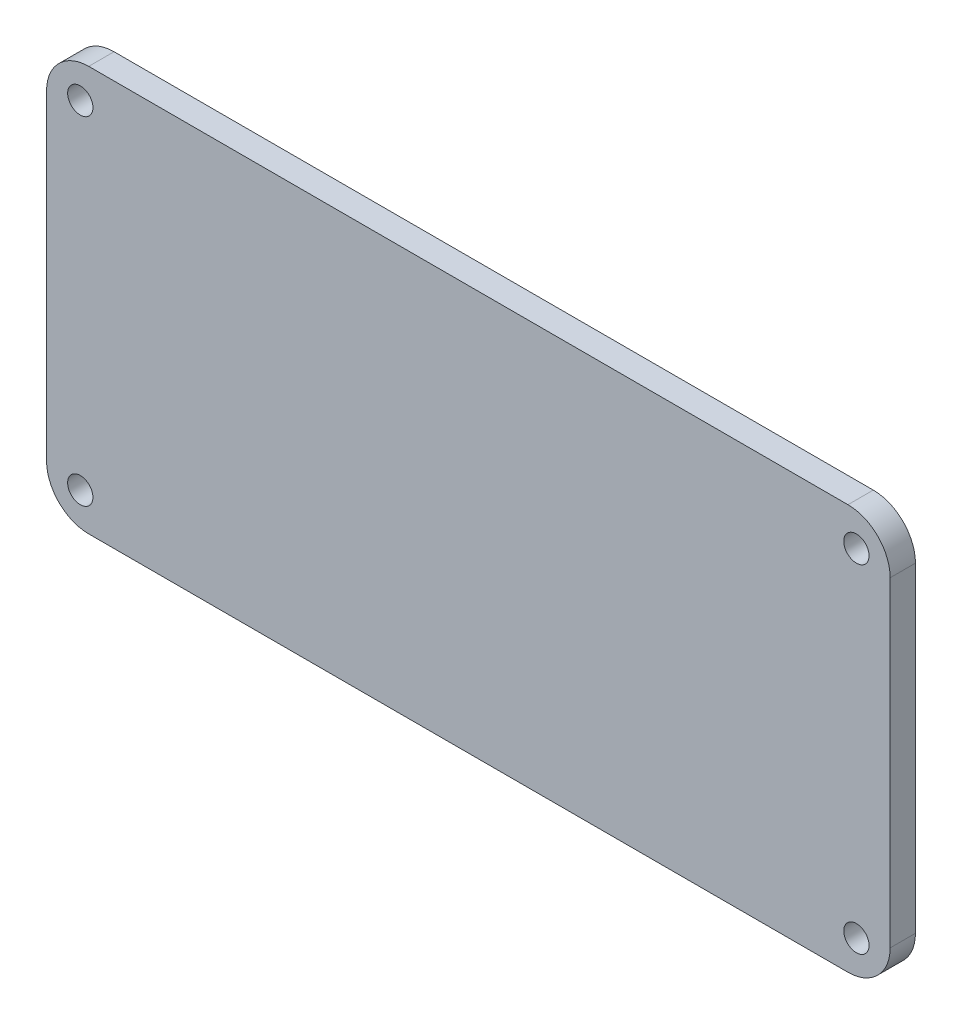
ISO-10303-21;
HEADER;
FILE_DESCRIPTION(('STEP AP214'),'2;1');
FILE_NAME('part.step','',(''),(''),'','','');
FILE_SCHEMA(('AUTOMOTIVE_DESIGN { 1 0 10303 214 1 1 1 1 }'));
ENDSEC;
DATA;
#1=APPLICATION_CONTEXT('core data for automotive mechanical design processes');
#2=APPLICATION_PROTOCOL_DEFINITION('international standard','automotive_design',2000,#1);
#3=PRODUCT_CONTEXT('',#1,'mechanical');
#4=PRODUCT('Part','Part','',(#3));
#5=PRODUCT_RELATED_PRODUCT_CATEGORY('part','',(#4));
#6=PRODUCT_DEFINITION_FORMATION('','',#4);
#7=PRODUCT_DEFINITION_CONTEXT('part definition',#1,'design');
#8=PRODUCT_DEFINITION('design','',#6,#7);
#9=PRODUCT_DEFINITION_SHAPE('','',#8);
#10=(LENGTH_UNIT() NAMED_UNIT(*) SI_UNIT(.MILLI.,.METRE.));
#11=(NAMED_UNIT(*) PLANE_ANGLE_UNIT() SI_UNIT($,.RADIAN.));
#12=(NAMED_UNIT(*) SI_UNIT($,.STERADIAN.) SOLID_ANGLE_UNIT());
#13=UNCERTAINTY_MEASURE_WITH_UNIT(LENGTH_MEASURE(1.E-05),#10,'distance_accuracy_value','');
#14=(GEOMETRIC_REPRESENTATION_CONTEXT(3) GLOBAL_UNCERTAINTY_ASSIGNED_CONTEXT((#13)) GLOBAL_UNIT_ASSIGNED_CONTEXT((#10,
#11,#12)) REPRESENTATION_CONTEXT('',''));
#15=CARTESIAN_POINT('',(0.,0.,0.));
#16=DIRECTION('',(0.,0.,1.));
#17=DIRECTION('',(1.,0.,0.));
#18=AXIS2_PLACEMENT_3D('',#15,#16,#17);
#19=CARTESIAN_POINT('',(-45.,19.,3.));
#20=DIRECTION('',(0.,0.,-1.));
#21=DIRECTION('',(-1.,0.,0.));
#22=AXIS2_PLACEMENT_3D('',#19,#20,#21);
#23=CYLINDRICAL_SURFACE('',#22,5.);
#24=CARTESIAN_POINT('',(-45.,19.,0.));
#25=DIRECTION('',(0.,0.,1.));
#26=DIRECTION('',(-1.,0.,0.));
#27=AXIS2_PLACEMENT_3D('',#24,#25,#26);
#28=CIRCLE('',#27,5.);
#29=CARTESIAN_POINT('',(-45.,24.,0.));
#30=VERTEX_POINT('',#29);
#31=CARTESIAN_POINT('',(-50.,19.,0.));
#32=VERTEX_POINT('',#31);
#33=EDGE_CURVE('E135',#30,#32,#28,.T.);
#34=ORIENTED_EDGE('',*,*,#33,.T.);
#35=DIRECTION('',(0.,0.,-1.));
#36=VECTOR('',#35,1.);
#37=CARTESIAN_POINT('',(-50.,19.,3.));
#38=LINE('',#37,#36);
#39=CARTESIAN_POINT('',(-50.,19.,3.));
#40=VERTEX_POINT('',#39);
#41=EDGE_CURVE('E11',#40,#32,#38,.T.);
#42=ORIENTED_EDGE('',*,*,#41,.F.);
#43=CARTESIAN_POINT('',(-45.,19.,3.));
#44=DIRECTION('',(0.,0.,1.));
#45=DIRECTION('',(-1.,0.,0.));
#46=AXIS2_PLACEMENT_3D('',#43,#44,#45);
#47=CIRCLE('',#46,5.);
#48=CARTESIAN_POINT('',(-45.,24.,3.));
#49=VERTEX_POINT('',#48);
#50=EDGE_CURVE('E150',#49,#40,#47,.T.);
#51=ORIENTED_EDGE('',*,*,#50,.F.);
#52=DIRECTION('',(0.,0.,-1.));
#53=VECTOR('',#52,1.);
#54=CARTESIAN_POINT('',(-45.,24.,3.));
#55=LINE('',#54,#53);
#56=EDGE_CURVE('E131',#49,#30,#55,.T.);
#57=ORIENTED_EDGE('',*,*,#56,.T.);
#58=EDGE_LOOP('',(#34,#42,#51,#57));
#59=FACE_BOUND('',#58,.T.);
#60=ADVANCED_FACE('F39',(#59),#23,.T.);
#61=CARTESIAN_POINT('',(-50.,19.,3.));
#62=DIRECTION('',(1.,0.,0.));
#63=DIRECTION('',(0.,0.,-1.));
#64=AXIS2_PLACEMENT_3D('',#61,#62,#63);
#65=PLANE('',#64);
#66=DIRECTION('',(0.,-1.,0.));
#67=VECTOR('',#66,1.);
#68=CARTESIAN_POINT('',(-50.,19.,0.));
#69=LINE('',#68,#67);
#70=CARTESIAN_POINT('',(-50.,-19.,0.));
#71=VERTEX_POINT('',#70);
#72=EDGE_CURVE('E138',#32,#71,#69,.T.);
#73=ORIENTED_EDGE('',*,*,#72,.T.);
#74=DIRECTION('',(0.,0.,-1.));
#75=VECTOR('',#74,1.);
#76=CARTESIAN_POINT('',(-50.,-19.,3.));
#77=LINE('',#76,#75);
#78=CARTESIAN_POINT('',(-50.,-19.,3.));
#79=VERTEX_POINT('',#78);
#80=EDGE_CURVE('E47',#79,#71,#77,.T.);
#81=ORIENTED_EDGE('',*,*,#80,.F.);
#82=DIRECTION('',(0.,-1.,0.));
#83=VECTOR('',#82,1.);
#84=CARTESIAN_POINT('',(-50.,19.,3.));
#85=LINE('',#84,#83);
#86=EDGE_CURVE('E98',#40,#79,#85,.T.);
#87=ORIENTED_EDGE('',*,*,#86,.F.);
#88=ORIENTED_EDGE('',*,*,#41,.T.);
#89=EDGE_LOOP('',(#73,#81,#87,#88));
#90=FACE_BOUND('',#89,.T.);
#91=ADVANCED_FACE('F232',(#90),#65,.F.);
#92=CARTESIAN_POINT('',(-45.,-19.,3.));
#93=DIRECTION('',(0.,0.,-1.));
#94=DIRECTION('',(-1.,0.,0.));
#95=AXIS2_PLACEMENT_3D('',#92,#93,#94);
#96=CYLINDRICAL_SURFACE('',#95,5.);
#97=CARTESIAN_POINT('',(-45.,-19.,0.));
#98=DIRECTION('',(0.,0.,1.));
#99=DIRECTION('',(-1.,0.,0.));
#100=AXIS2_PLACEMENT_3D('',#97,#98,#99);
#101=CIRCLE('',#100,5.);
#102=CARTESIAN_POINT('',(-45.,-24.,0.));
#103=VERTEX_POINT('',#102);
#104=EDGE_CURVE('E141',#71,#103,#101,.T.);
#105=ORIENTED_EDGE('',*,*,#104,.T.);
#106=DIRECTION('',(0.,0.,-1.));
#107=VECTOR('',#106,1.);
#108=CARTESIAN_POINT('',(-45.,-24.,3.));
#109=LINE('',#108,#107);
#110=CARTESIAN_POINT('',(-45.,-24.,3.));
#111=VERTEX_POINT('',#110);
#112=EDGE_CURVE('E157',#111,#103,#109,.T.);
#113=ORIENTED_EDGE('',*,*,#112,.F.);
#114=CARTESIAN_POINT('',(-45.,-19.,3.));
#115=DIRECTION('',(0.,0.,1.));
#116=DIRECTION('',(-1.,0.,0.));
#117=AXIS2_PLACEMENT_3D('',#114,#115,#116);
#118=CIRCLE('',#117,5.);
#119=EDGE_CURVE('E165',#79,#111,#118,.T.);
#120=ORIENTED_EDGE('',*,*,#119,.F.);
#121=ORIENTED_EDGE('',*,*,#80,.T.);
#122=EDGE_LOOP('',(#105,#113,#120,#121));
#123=FACE_BOUND('',#122,.T.);
#124=ADVANCED_FACE('F163',(#123),#96,.T.);
#125=CARTESIAN_POINT('',(-45.,-24.,3.));
#126=DIRECTION('',(0.,1.,0.));
#127=DIRECTION('',(0.,0.,1.));
#128=AXIS2_PLACEMENT_3D('',#125,#126,#127);
#129=PLANE('',#128);
#130=DIRECTION('',(1.,0.,0.));
#131=VECTOR('',#130,1.);
#132=CARTESIAN_POINT('',(-45.,-24.,0.));
#133=LINE('',#132,#131);
#134=CARTESIAN_POINT('',(45.,-24.,0.));
#135=VERTEX_POINT('',#134);
#136=EDGE_CURVE('E143',#103,#135,#133,.T.);
#137=ORIENTED_EDGE('',*,*,#136,.T.);
#138=DIRECTION('',(0.,0.,-1.));
#139=VECTOR('',#138,1.);
#140=CARTESIAN_POINT('',(45.,-24.,3.));
#141=LINE('',#140,#139);
#142=CARTESIAN_POINT('',(45.,-24.,3.));
#143=VERTEX_POINT('',#142);
#144=EDGE_CURVE('E154',#143,#135,#141,.T.);
#145=ORIENTED_EDGE('',*,*,#144,.F.);
#146=DIRECTION('',(1.,0.,0.));
#147=VECTOR('',#146,1.);
#148=CARTESIAN_POINT('',(-45.,-24.,3.));
#149=LINE('',#148,#147);
#150=EDGE_CURVE('E177',#111,#143,#149,.T.);
#151=ORIENTED_EDGE('',*,*,#150,.F.);
#152=ORIENTED_EDGE('',*,*,#112,.T.);
#153=EDGE_LOOP('',(#137,#145,#151,#152));
#154=FACE_BOUND('',#153,.T.);
#155=ADVANCED_FACE('F173',(#154),#129,.F.);
#156=CARTESIAN_POINT('',(45.,-19.,3.));
#157=DIRECTION('',(0.,0.,-1.));
#158=DIRECTION('',(-1.,0.,0.));
#159=AXIS2_PLACEMENT_3D('',#156,#157,#158);
#160=CYLINDRICAL_SURFACE('',#159,5.);
#161=CARTESIAN_POINT('',(45.,-19.,0.));
#162=DIRECTION('',(0.,0.,1.));
#163=DIRECTION('',(1.,0.,0.));
#164=AXIS2_PLACEMENT_3D('',#161,#162,#163);
#165=CIRCLE('',#164,5.);
#166=CARTESIAN_POINT('',(50.,-19.,0.));
#167=VERTEX_POINT('',#166);
#168=EDGE_CURVE('E145',#135,#167,#165,.T.);
#169=ORIENTED_EDGE('',*,*,#168,.T.);
#170=DIRECTION('',(0.,0.,-1.));
#171=VECTOR('',#170,1.);
#172=CARTESIAN_POINT('',(50.,-19.,3.));
#173=LINE('',#172,#171);
#174=CARTESIAN_POINT('',(50.,-19.,3.));
#175=VERTEX_POINT('',#174);
#176=EDGE_CURVE('E126',#175,#167,#173,.T.);
#177=ORIENTED_EDGE('',*,*,#176,.F.);
#178=CARTESIAN_POINT('',(45.,-19.,3.));
#179=DIRECTION('',(0.,0.,1.));
#180=DIRECTION('',(1.,0.,0.));
#181=AXIS2_PLACEMENT_3D('',#178,#179,#180);
#182=CIRCLE('',#181,5.);
#183=EDGE_CURVE('E117',#143,#175,#182,.T.);
#184=ORIENTED_EDGE('',*,*,#183,.F.);
#185=ORIENTED_EDGE('',*,*,#144,.T.);
#186=EDGE_LOOP('',(#169,#177,#184,#185));
#187=FACE_BOUND('',#186,.T.);
#188=ADVANCED_FACE('F176',(#187),#160,.T.);
#189=CARTESIAN_POINT('',(50.,19.,3.));
#190=DIRECTION('',(-1.,0.,0.));
#191=DIRECTION('',(0.,0.,1.));
#192=AXIS2_PLACEMENT_3D('',#189,#190,#191);
#193=PLANE('',#192);
#194=DIRECTION('',(0.,1.,0.));
#195=VECTOR('',#194,1.);
#196=CARTESIAN_POINT('',(50.,19.,0.));
#197=LINE('',#196,#195);
#198=CARTESIAN_POINT('',(50.,19.,0.));
#199=VERTEX_POINT('',#198);
#200=EDGE_CURVE('E125',#167,#199,#197,.T.);
#201=ORIENTED_EDGE('',*,*,#200,.T.);
#202=DIRECTION('',(0.,0.,-1.));
#203=VECTOR('',#202,1.);
#204=CARTESIAN_POINT('',(50.,19.,3.));
#205=LINE('',#204,#203);
#206=CARTESIAN_POINT('',(50.,19.,3.));
#207=VERTEX_POINT('',#206);
#208=EDGE_CURVE('E122',#207,#199,#205,.T.);
#209=ORIENTED_EDGE('',*,*,#208,.F.);
#210=DIRECTION('',(0.,1.,0.));
#211=VECTOR('',#210,1.);
#212=CARTESIAN_POINT('',(50.,19.,3.));
#213=LINE('',#212,#211);
#214=EDGE_CURVE('E111',#175,#207,#213,.T.);
#215=ORIENTED_EDGE('',*,*,#214,.F.);
#216=ORIENTED_EDGE('',*,*,#176,.T.);
#217=EDGE_LOOP('',(#201,#209,#215,#216));
#218=FACE_BOUND('',#217,.T.);
#219=ADVANCED_FACE('F123',(#218),#193,.F.);
#220=CARTESIAN_POINT('',(45.,19.,3.));
#221=DIRECTION('',(0.,0.,-1.));
#222=DIRECTION('',(-1.,0.,0.));
#223=AXIS2_PLACEMENT_3D('',#220,#221,#222);
#224=CYLINDRICAL_SURFACE('',#223,5.);
#225=CARTESIAN_POINT('',(45.,19.,0.));
#226=DIRECTION('',(0.,0.,1.));
#227=DIRECTION('',(1.,0.,0.));
#228=AXIS2_PLACEMENT_3D('',#225,#226,#227);
#229=CIRCLE('',#228,5.);
#230=CARTESIAN_POINT('',(45.,24.,0.));
#231=VERTEX_POINT('',#230);
#232=EDGE_CURVE('E84',#199,#231,#229,.T.);
#233=ORIENTED_EDGE('',*,*,#232,.T.);
#234=DIRECTION('',(0.,0.,-1.));
#235=VECTOR('',#234,1.);
#236=CARTESIAN_POINT('',(45.,24.,3.));
#237=LINE('',#236,#235);
#238=CARTESIAN_POINT('',(45.,24.,3.));
#239=VERTEX_POINT('',#238);
#240=EDGE_CURVE('E127',#239,#231,#237,.T.);
#241=ORIENTED_EDGE('',*,*,#240,.F.);
#242=CARTESIAN_POINT('',(45.,19.,3.));
#243=DIRECTION('',(0.,0.,1.));
#244=DIRECTION('',(1.,0.,0.));
#245=AXIS2_PLACEMENT_3D('',#242,#243,#244);
#246=CIRCLE('',#245,5.);
#247=EDGE_CURVE('E115',#207,#239,#246,.T.);
#248=ORIENTED_EDGE('',*,*,#247,.F.);
#249=ORIENTED_EDGE('',*,*,#208,.T.);
#250=EDGE_LOOP('',(#233,#241,#248,#249));
#251=FACE_BOUND('',#250,.T.);
#252=ADVANCED_FACE('F129',(#251),#224,.T.);
#253=CARTESIAN_POINT('',(-45.,24.,3.));
#254=DIRECTION('',(0.,-1.,0.));
#255=DIRECTION('',(0.,0.,-1.));
#256=AXIS2_PLACEMENT_3D('',#253,#254,#255);
#257=PLANE('',#256);
#258=DIRECTION('',(-1.,0.,0.));
#259=VECTOR('',#258,1.);
#260=CARTESIAN_POINT('',(-45.,24.,0.));
#261=LINE('',#260,#259);
#262=EDGE_CURVE('E90',#231,#30,#261,.T.);
#263=ORIENTED_EDGE('',*,*,#262,.T.);
#264=ORIENTED_EDGE('',*,*,#56,.F.);
#265=DIRECTION('',(-1.,0.,0.));
#266=VECTOR('',#265,1.);
#267=CARTESIAN_POINT('',(-45.,24.,3.));
#268=LINE('',#267,#266);
#269=EDGE_CURVE('E55',#239,#49,#268,.T.);
#270=ORIENTED_EDGE('',*,*,#269,.F.);
#271=ORIENTED_EDGE('',*,*,#240,.T.);
#272=EDGE_LOOP('',(#263,#264,#270,#271));
#273=FACE_BOUND('',#272,.T.);
#274=ADVANCED_FACE('F211',(#273),#257,.F.);
#275=CARTESIAN_POINT('',(-45.,19.,3.));
#276=DIRECTION('',(0.,0.,-1.));
#277=DIRECTION('',(-1.,0.,0.));
#278=AXIS2_PLACEMENT_3D('',#275,#276,#277);
#279=PLANE('',#278);
#280=CARTESIAN_POINT('',(46.,20.,3.));
#281=DIRECTION('',(0.,0.,1.));
#282=DIRECTION('',(1.,0.,0.));
#283=AXIS2_PLACEMENT_3D('',#280,#281,#282);
#284=CIRCLE('',#283,1.5);
#285=CARTESIAN_POINT('',(47.5,20.,3.));
#286=VERTEX_POINT('',#285);
#287=EDGE_CURVE('E186',#286,#286,#284,.T.);
#288=ORIENTED_EDGE('',*,*,#287,.F.);
#289=EDGE_LOOP('',(#288));
#290=FACE_BOUND('',#289,.T.);
#291=CARTESIAN_POINT('',(-46.,-20.,3.));
#292=DIRECTION('',(0.,0.,1.));
#293=DIRECTION('',(1.,0.,0.));
#294=AXIS2_PLACEMENT_3D('',#291,#292,#293);
#295=CIRCLE('',#294,1.5);
#296=CARTESIAN_POINT('',(-44.5,-20.,3.));
#297=VERTEX_POINT('',#296);
#298=EDGE_CURVE('E192',#297,#297,#295,.T.);
#299=ORIENTED_EDGE('',*,*,#298,.F.);
#300=EDGE_LOOP('',(#299));
#301=FACE_BOUND('',#300,.T.);
#302=CARTESIAN_POINT('',(46.,-20.,3.));
#303=DIRECTION('',(0.,0.,1.));
#304=DIRECTION('',(1.,0.,0.));
#305=AXIS2_PLACEMENT_3D('',#302,#303,#304);
#306=CIRCLE('',#305,1.5);
#307=CARTESIAN_POINT('',(47.5,-20.,3.));
#308=VERTEX_POINT('',#307);
#309=EDGE_CURVE('E193',#308,#308,#306,.T.);
#310=ORIENTED_EDGE('',*,*,#309,.F.);
#311=EDGE_LOOP('',(#310));
#312=FACE_BOUND('',#311,.T.);
#313=CARTESIAN_POINT('',(-46.,20.,3.));
#314=DIRECTION('',(0.,0.,1.));
#315=DIRECTION('',(1.,0.,0.));
#316=AXIS2_PLACEMENT_3D('',#313,#314,#315);
#317=CIRCLE('',#316,1.5);
#318=CARTESIAN_POINT('',(-44.5,20.,3.));
#319=VERTEX_POINT('',#318);
#320=EDGE_CURVE('E183',#319,#319,#317,.T.);
#321=ORIENTED_EDGE('',*,*,#320,.F.);
#322=EDGE_LOOP('',(#321));
#323=FACE_BOUND('',#322,.T.);
#324=ORIENTED_EDGE('',*,*,#50,.T.);
#325=ORIENTED_EDGE('',*,*,#86,.T.);
#326=ORIENTED_EDGE('',*,*,#119,.T.);
#327=ORIENTED_EDGE('',*,*,#150,.T.);
#328=ORIENTED_EDGE('',*,*,#183,.T.);
#329=ORIENTED_EDGE('',*,*,#214,.T.);
#330=ORIENTED_EDGE('',*,*,#247,.T.);
#331=ORIENTED_EDGE('',*,*,#269,.T.);
#332=EDGE_LOOP('',(#324,#325,#326,#327,#328,#329,#330,#331));
#333=FACE_BOUND('',#332,.T.);
#334=ADVANCED_FACE('F113',(#290,#301,#312,#323,#333),#279,.F.);
#335=CARTESIAN_POINT('',(-45.,19.,0.));
#336=DIRECTION('',(0.,0.,-1.));
#337=DIRECTION('',(-1.,0.,0.));
#338=AXIS2_PLACEMENT_3D('',#335,#336,#337);
#339=PLANE('',#338);
#340=CARTESIAN_POINT('',(46.,20.,0.));
#341=DIRECTION('',(0.,0.,1.));
#342=DIRECTION('',(1.,0.,0.));
#343=AXIS2_PLACEMENT_3D('',#340,#341,#342);
#344=CIRCLE('',#343,1.5);
#345=CARTESIAN_POINT('',(47.5,20.,0.));
#346=VERTEX_POINT('',#345);
#347=EDGE_CURVE('E196',#346,#346,#344,.T.);
#348=ORIENTED_EDGE('',*,*,#347,.T.);
#349=EDGE_LOOP('',(#348));
#350=FACE_BOUND('',#349,.T.);
#351=CARTESIAN_POINT('',(-46.,-20.,0.));
#352=DIRECTION('',(0.,0.,1.));
#353=DIRECTION('',(1.,0.,0.));
#354=AXIS2_PLACEMENT_3D('',#351,#352,#353);
#355=CIRCLE('',#354,1.5);
#356=CARTESIAN_POINT('',(-44.5,-20.,0.));
#357=VERTEX_POINT('',#356);
#358=EDGE_CURVE('E189',#357,#357,#355,.T.);
#359=ORIENTED_EDGE('',*,*,#358,.T.);
#360=EDGE_LOOP('',(#359));
#361=FACE_BOUND('',#360,.T.);
#362=CARTESIAN_POINT('',(46.,-20.,0.));
#363=DIRECTION('',(0.,0.,1.));
#364=DIRECTION('',(1.,0.,0.));
#365=AXIS2_PLACEMENT_3D('',#362,#363,#364);
#366=CIRCLE('',#365,1.5);
#367=CARTESIAN_POINT('',(47.5,-20.,0.));
#368=VERTEX_POINT('',#367);
#369=EDGE_CURVE('E201',#368,#368,#366,.T.);
#370=ORIENTED_EDGE('',*,*,#369,.T.);
#371=EDGE_LOOP('',(#370));
#372=FACE_BOUND('',#371,.T.);
#373=CARTESIAN_POINT('',(-46.,20.,0.));
#374=DIRECTION('',(0.,0.,1.));
#375=DIRECTION('',(1.,0.,0.));
#376=AXIS2_PLACEMENT_3D('',#373,#374,#375);
#377=CIRCLE('',#376,1.5);
#378=CARTESIAN_POINT('',(-44.5,20.,0.));
#379=VERTEX_POINT('',#378);
#380=EDGE_CURVE('E139',#379,#379,#377,.T.);
#381=ORIENTED_EDGE('',*,*,#380,.T.);
#382=EDGE_LOOP('',(#381));
#383=FACE_BOUND('',#382,.T.);
#384=ORIENTED_EDGE('',*,*,#33,.F.);
#385=ORIENTED_EDGE('',*,*,#262,.F.);
#386=ORIENTED_EDGE('',*,*,#232,.F.);
#387=ORIENTED_EDGE('',*,*,#200,.F.);
#388=ORIENTED_EDGE('',*,*,#168,.F.);
#389=ORIENTED_EDGE('',*,*,#136,.F.);
#390=ORIENTED_EDGE('',*,*,#104,.F.);
#391=ORIENTED_EDGE('',*,*,#72,.F.);
#392=EDGE_LOOP('',(#384,#385,#386,#387,#388,#389,#390,#391));
#393=FACE_BOUND('',#392,.T.);
#394=ADVANCED_FACE('F169',(#350,#361,#372,#383,#393),#339,.T.);
#395=CARTESIAN_POINT('',(-46.,20.,0.));
#396=DIRECTION('',(0.,0.,1.));
#397=DIRECTION('',(1.,0.,0.));
#398=AXIS2_PLACEMENT_3D('',#395,#396,#397);
#399=CYLINDRICAL_SURFACE('',#398,1.5);
#400=ORIENTED_EDGE('',*,*,#380,.F.);
#401=EDGE_LOOP('',(#400));
#402=FACE_BOUND('',#401,.T.);
#403=ORIENTED_EDGE('',*,*,#320,.T.);
#404=EDGE_LOOP('',(#403));
#405=FACE_BOUND('',#404,.T.);
#406=ADVANCED_FACE('F216',(#402,#405),#399,.F.);
#407=CARTESIAN_POINT('',(46.,-20.,0.));
#408=DIRECTION('',(0.,0.,1.));
#409=DIRECTION('',(1.,0.,0.));
#410=AXIS2_PLACEMENT_3D('',#407,#408,#409);
#411=CYLINDRICAL_SURFACE('',#410,1.5);
#412=ORIENTED_EDGE('',*,*,#369,.F.);
#413=EDGE_LOOP('',(#412));
#414=FACE_BOUND('',#413,.T.);
#415=ORIENTED_EDGE('',*,*,#309,.T.);
#416=EDGE_LOOP('',(#415));
#417=FACE_BOUND('',#416,.T.);
#418=ADVANCED_FACE('F207',(#414,#417),#411,.F.);
#419=CARTESIAN_POINT('',(-46.,-20.,0.));
#420=DIRECTION('',(0.,0.,1.));
#421=DIRECTION('',(1.,0.,0.));
#422=AXIS2_PLACEMENT_3D('',#419,#420,#421);
#423=CYLINDRICAL_SURFACE('',#422,1.5);
#424=ORIENTED_EDGE('',*,*,#358,.F.);
#425=EDGE_LOOP('',(#424));
#426=FACE_BOUND('',#425,.T.);
#427=ORIENTED_EDGE('',*,*,#298,.T.);
#428=EDGE_LOOP('',(#427));
#429=FACE_BOUND('',#428,.T.);
#430=ADVANCED_FACE('F224',(#426,#429),#423,.F.);
#431=CARTESIAN_POINT('',(46.,20.,0.));
#432=DIRECTION('',(0.,0.,1.));
#433=DIRECTION('',(1.,0.,0.));
#434=AXIS2_PLACEMENT_3D('',#431,#432,#433);
#435=CYLINDRICAL_SURFACE('',#434,1.5);
#436=ORIENTED_EDGE('',*,*,#347,.F.);
#437=EDGE_LOOP('',(#436));
#438=FACE_BOUND('',#437,.T.);
#439=ORIENTED_EDGE('',*,*,#287,.T.);
#440=EDGE_LOOP('',(#439));
#441=FACE_BOUND('',#440,.T.);
#442=ADVANCED_FACE('F314',(#438,#441),#435,.F.);
#443=CLOSED_SHELL('',(#60,#91,#124,#155,#188,#219,#252,#274,#334,#394,#406,#418,#430,#442));
#444=MANIFOLD_SOLID_BREP('B2',#443);
#445=ADVANCED_BREP_SHAPE_REPRESENTATION('',(#18,#444),#14);
#446=SHAPE_DEFINITION_REPRESENTATION(#9,#445);
ENDSEC;
END-ISO-10303-21;
